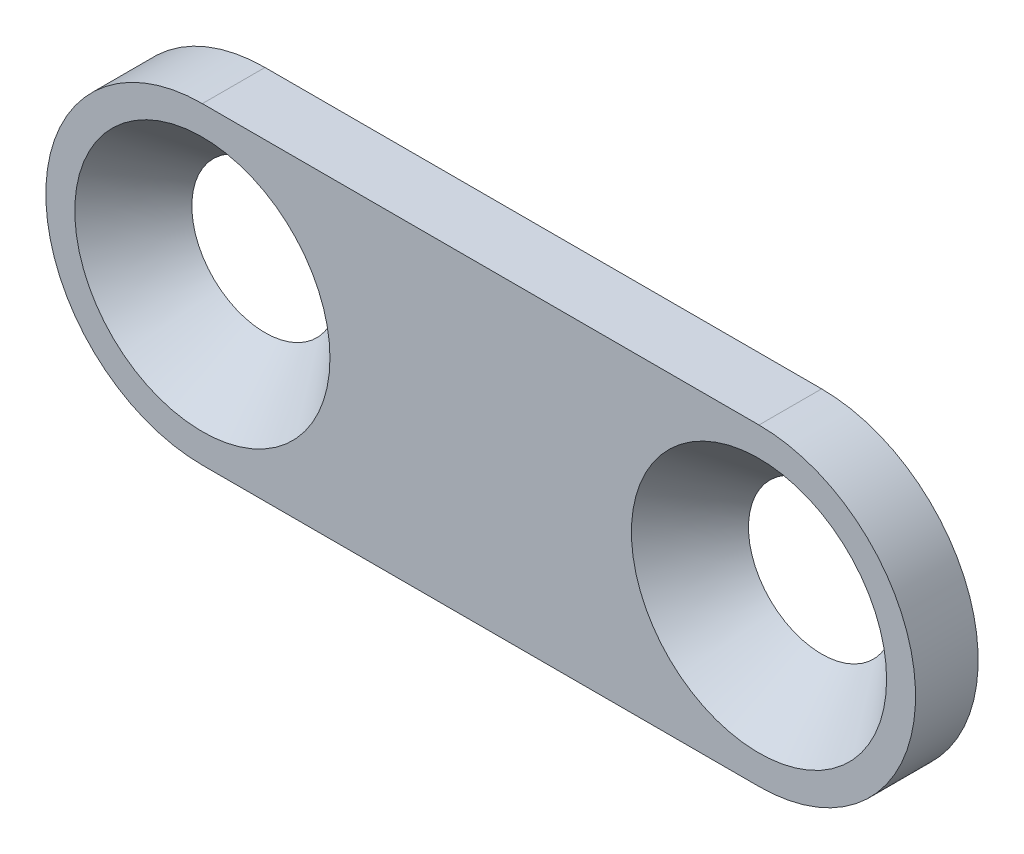
ISO-10303-21;
HEADER;
FILE_DESCRIPTION(('STEP AP214'),'2;1');
FILE_NAME('part.step','',(''),(''),'','','');
FILE_SCHEMA(('AUTOMOTIVE_DESIGN { 1 0 10303 214 1 1 1 1 }'));
ENDSEC;
DATA;
#1=APPLICATION_CONTEXT('core data for automotive mechanical design processes');
#2=APPLICATION_PROTOCOL_DEFINITION('international standard','automotive_design',2000,#1);
#3=PRODUCT_CONTEXT('',#1,'mechanical');
#4=PRODUCT('Part','Part','',(#3));
#5=PRODUCT_RELATED_PRODUCT_CATEGORY('part','',(#4));
#6=PRODUCT_DEFINITION_FORMATION('','',#4);
#7=PRODUCT_DEFINITION_CONTEXT('part definition',#1,'design');
#8=PRODUCT_DEFINITION('design','',#6,#7);
#9=PRODUCT_DEFINITION_SHAPE('','',#8);
#10=(LENGTH_UNIT() NAMED_UNIT(*) SI_UNIT(.MILLI.,.METRE.));
#11=(NAMED_UNIT(*) PLANE_ANGLE_UNIT() SI_UNIT($,.RADIAN.));
#12=(NAMED_UNIT(*) SI_UNIT($,.STERADIAN.) SOLID_ANGLE_UNIT());
#13=UNCERTAINTY_MEASURE_WITH_UNIT(LENGTH_MEASURE(1.E-05),#10,'distance_accuracy_value','');
#14=(GEOMETRIC_REPRESENTATION_CONTEXT(3) GLOBAL_UNCERTAINTY_ASSIGNED_CONTEXT((#13)) GLOBAL_UNIT_ASSIGNED_CONTEXT((#10,
#11,#12)) REPRESENTATION_CONTEXT('',''));
#15=CARTESIAN_POINT('',(0.,0.,0.));
#16=DIRECTION('',(0.,0.,1.));
#17=DIRECTION('',(1.,0.,0.));
#18=AXIS2_PLACEMENT_3D('',#15,#16,#17);
#19=CARTESIAN_POINT('',(10.16,0.,-2.286));
#20=DIRECTION('',(0.,0.,1.));
#21=DIRECTION('',(1.,0.,0.));
#22=AXIS2_PLACEMENT_3D('',#19,#20,#21);
#23=PLANE('',#22);
#24=CARTESIAN_POINT('',(-10.16,0.,-2.286));
#25=DIRECTION('',(0.,0.,1.));
#26=DIRECTION('',(1.,0.,0.));
#27=AXIS2_PLACEMENT_3D('',#24,#25,#26);
#28=CIRCLE('',#27,2.67080221735211);
#29=CARTESIAN_POINT('',(-7.48919778264789,0.,-2.286));
#30=VERTEX_POINT('',#29);
#31=EDGE_CURVE('E155',#30,#30,#28,.T.);
#32=ORIENTED_EDGE('',*,*,#31,.T.);
#33=EDGE_LOOP('',(#32));
#34=FACE_BOUND('',#33,.T.);
#35=CARTESIAN_POINT('',(10.16,0.,-2.286));
#36=DIRECTION('',(0.,0.,1.));
#37=DIRECTION('',(1.,0.,0.));
#38=AXIS2_PLACEMENT_3D('',#35,#36,#37);
#39=CIRCLE('',#38,2.67080221735211);
#40=CARTESIAN_POINT('',(12.8308022173521,0.,-2.286));
#41=VERTEX_POINT('',#40);
#42=EDGE_CURVE('E113',#41,#41,#39,.T.);
#43=ORIENTED_EDGE('',*,*,#42,.T.);
#44=EDGE_LOOP('',(#43));
#45=FACE_BOUND('',#44,.T.);
#46=CARTESIAN_POINT('',(10.16,0.,-2.286));
#47=DIRECTION('',(0.,0.,1.));
#48=DIRECTION('',(1.,0.,0.));
#49=AXIS2_PLACEMENT_3D('',#46,#47,#48);
#50=CIRCLE('',#49,5.715);
#51=CARTESIAN_POINT('',(10.16,-5.715,-2.286));
#52=VERTEX_POINT('',#51);
#53=CARTESIAN_POINT('',(10.16,5.715,-2.286));
#54=VERTEX_POINT('',#53);
#55=EDGE_CURVE('E101',#52,#54,#50,.T.);
#56=ORIENTED_EDGE('',*,*,#55,.F.);
#57=DIRECTION('',(1.,0.,0.));
#58=VECTOR('',#57,1.);
#59=CARTESIAN_POINT('',(10.16,-5.715,-2.286));
#60=LINE('',#59,#58);
#61=CARTESIAN_POINT('',(-10.16,-5.715,-2.286));
#62=VERTEX_POINT('',#61);
#63=EDGE_CURVE('E97',#62,#52,#60,.T.);
#64=ORIENTED_EDGE('',*,*,#63,.F.);
#65=CARTESIAN_POINT('',(-10.16,0.,-2.286));
#66=DIRECTION('',(0.,0.,1.));
#67=DIRECTION('',(1.,0.,0.));
#68=AXIS2_PLACEMENT_3D('',#65,#66,#67);
#69=CIRCLE('',#68,5.715);
#70=CARTESIAN_POINT('',(-10.16,5.715,-2.286));
#71=VERTEX_POINT('',#70);
#72=EDGE_CURVE('E91',#71,#62,#69,.T.);
#73=ORIENTED_EDGE('',*,*,#72,.F.);
#74=DIRECTION('',(-1.,0.,0.));
#75=VECTOR('',#74,1.);
#76=CARTESIAN_POINT('',(10.16,5.715,-2.286));
#77=LINE('',#76,#75);
#78=EDGE_CURVE('E96',#54,#71,#77,.T.);
#79=ORIENTED_EDGE('',*,*,#78,.F.);
#80=EDGE_LOOP('',(#56,#64,#73,#79));
#81=FACE_BOUND('',#80,.T.);
#82=ADVANCED_FACE('F42',(#34,#45,#81),#23,.F.);
#83=CARTESIAN_POINT('',(10.16,0.,-2.286));
#84=DIRECTION('',(0.,0.,1.));
#85=DIRECTION('',(1.,0.,0.));
#86=AXIS2_PLACEMENT_3D('',#83,#84,#85);
#87=CYLINDRICAL_SURFACE('',#86,5.715);
#88=CARTESIAN_POINT('',(10.16,0.,0.));
#89=DIRECTION('',(0.,0.,1.));
#90=DIRECTION('',(1.,0.,0.));
#91=AXIS2_PLACEMENT_3D('',#88,#89,#90);
#92=CIRCLE('',#91,5.715);
#93=CARTESIAN_POINT('',(10.16,-5.715,0.));
#94=VERTEX_POINT('',#93);
#95=CARTESIAN_POINT('',(10.16,5.715,0.));
#96=VERTEX_POINT('',#95);
#97=EDGE_CURVE('E109',#94,#96,#92,.T.);
#98=ORIENTED_EDGE('',*,*,#97,.F.);
#99=DIRECTION('',(0.,0.,1.));
#100=VECTOR('',#99,1.);
#101=CARTESIAN_POINT('',(10.16,-5.715,-2.286));
#102=LINE('',#101,#100);
#103=EDGE_CURVE('E11',#52,#94,#102,.T.);
#104=ORIENTED_EDGE('',*,*,#103,.F.);
#105=ORIENTED_EDGE('',*,*,#55,.T.);
#106=DIRECTION('',(0.,0.,1.));
#107=VECTOR('',#106,1.);
#108=CARTESIAN_POINT('',(10.16,5.715,-2.286));
#109=LINE('',#108,#107);
#110=EDGE_CURVE('E46',#54,#96,#109,.T.);
#111=ORIENTED_EDGE('',*,*,#110,.T.);
#112=EDGE_LOOP('',(#98,#104,#105,#111));
#113=FACE_BOUND('',#112,.T.);
#114=ADVANCED_FACE('F44',(#113),#87,.T.);
#115=CARTESIAN_POINT('',(10.16,-5.715,-2.286));
#116=DIRECTION('',(0.,-1.,0.));
#117=DIRECTION('',(0.,0.,-1.));
#118=AXIS2_PLACEMENT_3D('',#115,#116,#117);
#119=PLANE('',#118);
#120=DIRECTION('',(1.,0.,0.));
#121=VECTOR('',#120,1.);
#122=CARTESIAN_POINT('',(10.16,-5.715,0.));
#123=LINE('',#122,#121);
#124=CARTESIAN_POINT('',(-10.16,-5.715,0.));
#125=VERTEX_POINT('',#124);
#126=EDGE_CURVE('E104',#125,#94,#123,.T.);
#127=ORIENTED_EDGE('',*,*,#126,.F.);
#128=DIRECTION('',(0.,0.,1.));
#129=VECTOR('',#128,1.);
#130=CARTESIAN_POINT('',(-10.16,-5.715,-2.286));
#131=LINE('',#130,#129);
#132=EDGE_CURVE('E52',#62,#125,#131,.T.);
#133=ORIENTED_EDGE('',*,*,#132,.F.);
#134=ORIENTED_EDGE('',*,*,#63,.T.);
#135=ORIENTED_EDGE('',*,*,#103,.T.);
#136=EDGE_LOOP('',(#127,#133,#134,#135));
#137=FACE_BOUND('',#136,.T.);
#138=ADVANCED_FACE('F121',(#137),#119,.T.);
#139=CARTESIAN_POINT('',(-10.16,0.,-2.286));
#140=DIRECTION('',(0.,0.,1.));
#141=DIRECTION('',(1.,0.,0.));
#142=AXIS2_PLACEMENT_3D('',#139,#140,#141);
#143=CYLINDRICAL_SURFACE('',#142,5.715);
#144=CARTESIAN_POINT('',(-10.16,0.,0.));
#145=DIRECTION('',(0.,0.,1.));
#146=DIRECTION('',(1.,0.,0.));
#147=AXIS2_PLACEMENT_3D('',#144,#145,#146);
#148=CIRCLE('',#147,5.715);
#149=CARTESIAN_POINT('',(-10.16,5.715,0.));
#150=VERTEX_POINT('',#149);
#151=EDGE_CURVE('E93',#150,#125,#148,.T.);
#152=ORIENTED_EDGE('',*,*,#151,.F.);
#153=DIRECTION('',(0.,0.,1.));
#154=VECTOR('',#153,1.);
#155=CARTESIAN_POINT('',(-10.16,5.715,-2.286));
#156=LINE('',#155,#154);
#157=EDGE_CURVE('E88',#71,#150,#156,.T.);
#158=ORIENTED_EDGE('',*,*,#157,.F.);
#159=ORIENTED_EDGE('',*,*,#72,.T.);
#160=ORIENTED_EDGE('',*,*,#132,.T.);
#161=EDGE_LOOP('',(#152,#158,#159,#160));
#162=FACE_BOUND('',#161,.T.);
#163=ADVANCED_FACE('F90',(#162),#143,.T.);
#164=CARTESIAN_POINT('',(10.16,5.715,-2.286));
#165=DIRECTION('',(0.,1.,0.));
#166=DIRECTION('',(0.,0.,1.));
#167=AXIS2_PLACEMENT_3D('',#164,#165,#166);
#168=PLANE('',#167);
#169=DIRECTION('',(-1.,0.,0.));
#170=VECTOR('',#169,1.);
#171=CARTESIAN_POINT('',(10.16,5.715,0.));
#172=LINE('',#171,#170);
#173=EDGE_CURVE('E112',#96,#150,#172,.T.);
#174=ORIENTED_EDGE('',*,*,#173,.F.);
#175=ORIENTED_EDGE('',*,*,#110,.F.);
#176=ORIENTED_EDGE('',*,*,#78,.T.);
#177=ORIENTED_EDGE('',*,*,#157,.T.);
#178=EDGE_LOOP('',(#174,#175,#176,#177));
#179=FACE_BOUND('',#178,.T.);
#180=ADVANCED_FACE('F99',(#179),#168,.T.);
#181=CARTESIAN_POINT('',(10.16,0.,0.));
#182=DIRECTION('',(0.,0.,1.));
#183=DIRECTION('',(1.,0.,0.));
#184=AXIS2_PLACEMENT_3D('',#181,#182,#183);
#185=PLANE('',#184);
#186=CARTESIAN_POINT('',(-10.16,0.,0.));
#187=DIRECTION('',(0.,0.,1.));
#188=DIRECTION('',(1.,0.,0.));
#189=AXIS2_PLACEMENT_3D('',#186,#187,#188);
#190=CIRCLE('',#189,4.6579917);
#191=CARTESIAN_POINT('',(-5.5020083,0.,0.));
#192=VERTEX_POINT('',#191);
#193=EDGE_CURVE('E151',#192,#192,#190,.T.);
#194=ORIENTED_EDGE('',*,*,#193,.F.);
#195=EDGE_LOOP('',(#194));
#196=FACE_BOUND('',#195,.T.);
#197=CARTESIAN_POINT('',(10.16,0.,0.));
#198=DIRECTION('',(0.,0.,1.));
#199=DIRECTION('',(1.,0.,0.));
#200=AXIS2_PLACEMENT_3D('',#197,#198,#199);
#201=CIRCLE('',#200,4.6579917);
#202=CARTESIAN_POINT('',(14.8179917,0.,0.));
#203=VERTEX_POINT('',#202);
#204=EDGE_CURVE('E154',#203,#203,#201,.T.);
#205=ORIENTED_EDGE('',*,*,#204,.F.);
#206=EDGE_LOOP('',(#205));
#207=FACE_BOUND('',#206,.T.);
#208=ORIENTED_EDGE('',*,*,#97,.T.);
#209=ORIENTED_EDGE('',*,*,#173,.T.);
#210=ORIENTED_EDGE('',*,*,#151,.T.);
#211=ORIENTED_EDGE('',*,*,#126,.T.);
#212=EDGE_LOOP('',(#208,#209,#210,#211));
#213=FACE_BOUND('',#212,.T.);
#214=ADVANCED_FACE('F120',(#196,#207,#213),#185,.T.);
#215=CARTESIAN_POINT('',(10.16,0.,0.));
#216=DIRECTION('',(0.,0.,1.));
#217=DIRECTION('',(1.,0.,0.));
#218=AXIS2_PLACEMENT_3D('',#215,#216,#217);
#219=CONICAL_SURFACE('',#218,4.6579917,0.715584993317675);
#220=ORIENTED_EDGE('',*,*,#204,.T.);
#221=EDGE_LOOP('',(#220));
#222=FACE_BOUND('',#221,.T.);
#223=ORIENTED_EDGE('',*,*,#42,.F.);
#224=EDGE_LOOP('',(#223));
#225=FACE_BOUND('',#224,.T.);
#226=ADVANCED_FACE('F138',(#222,#225),#219,.F.);
#227=CARTESIAN_POINT('',(-10.16,0.,0.));
#228=DIRECTION('',(0.,0.,1.));
#229=DIRECTION('',(1.,0.,0.));
#230=AXIS2_PLACEMENT_3D('',#227,#228,#229);
#231=CONICAL_SURFACE('',#230,4.6579917,0.715584993317675);
#232=ORIENTED_EDGE('',*,*,#193,.T.);
#233=EDGE_LOOP('',(#232));
#234=FACE_BOUND('',#233,.T.);
#235=ORIENTED_EDGE('',*,*,#31,.F.);
#236=EDGE_LOOP('',(#235));
#237=FACE_BOUND('',#236,.T.);
#238=ADVANCED_FACE('F146',(#234,#237),#231,.F.);
#239=CLOSED_SHELL('',(#82,#114,#138,#163,#180,#214,#226,#238));
#240=MANIFOLD_SOLID_BREP('B2',#239);
#241=ADVANCED_BREP_SHAPE_REPRESENTATION('',(#18,#240),#14);
#242=SHAPE_DEFINITION_REPRESENTATION(#9,#241);
ENDSEC;
END-ISO-10303-21;
